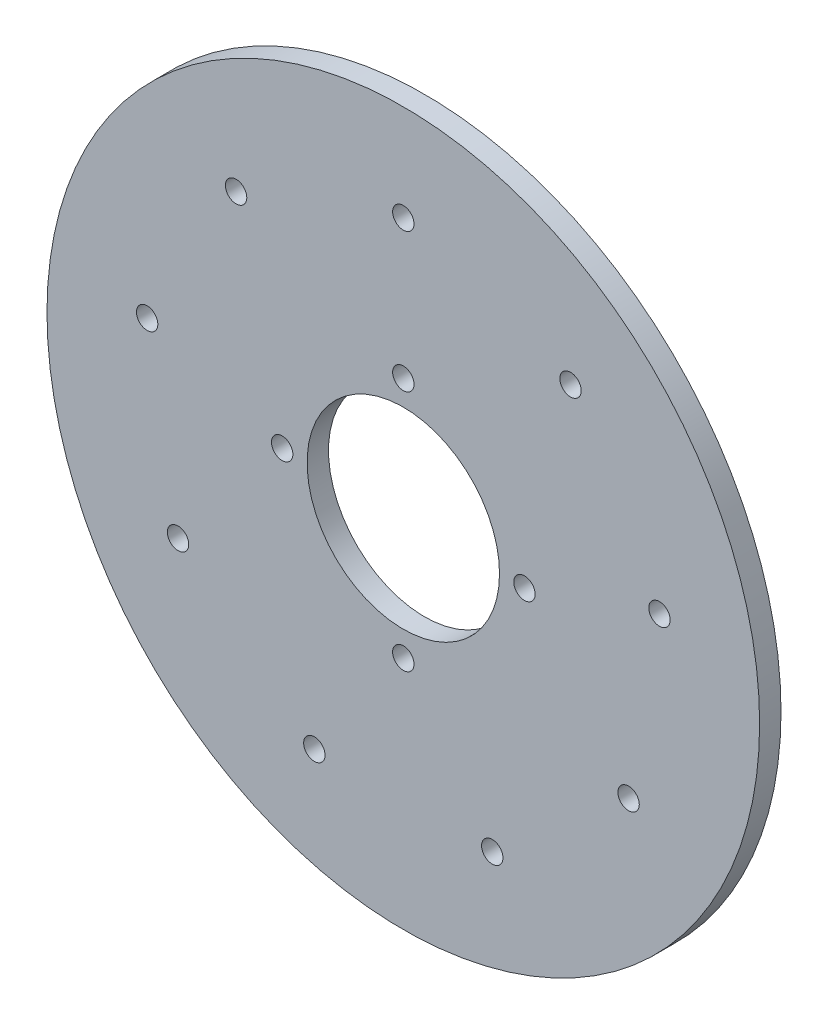
ISO-10303-21;
HEADER;
FILE_DESCRIPTION(('STEP AP214'),'2;1');
FILE_NAME('part.step','',(''),(''),'','','');
FILE_SCHEMA(('AUTOMOTIVE_DESIGN { 1 0 10303 214 1 1 1 1 }'));
ENDSEC;
DATA;
#1=APPLICATION_CONTEXT('core data for automotive mechanical design processes');
#2=APPLICATION_PROTOCOL_DEFINITION('international standard','automotive_design',2000,#1);
#3=PRODUCT_CONTEXT('',#1,'mechanical');
#4=PRODUCT('Part','Part','',(#3));
#5=PRODUCT_RELATED_PRODUCT_CATEGORY('part','',(#4));
#6=PRODUCT_DEFINITION_FORMATION('','',#4);
#7=PRODUCT_DEFINITION_CONTEXT('part definition',#1,'design');
#8=PRODUCT_DEFINITION('design','',#6,#7);
#9=PRODUCT_DEFINITION_SHAPE('','',#8);
#10=(LENGTH_UNIT() NAMED_UNIT(*) SI_UNIT(.MILLI.,.METRE.));
#11=(NAMED_UNIT(*) PLANE_ANGLE_UNIT() SI_UNIT($,.RADIAN.));
#12=(NAMED_UNIT(*) SI_UNIT($,.STERADIAN.) SOLID_ANGLE_UNIT());
#13=UNCERTAINTY_MEASURE_WITH_UNIT(LENGTH_MEASURE(1.E-05),#10,'distance_accuracy_value','');
#14=(GEOMETRIC_REPRESENTATION_CONTEXT(3) GLOBAL_UNCERTAINTY_ASSIGNED_CONTEXT((#13)) GLOBAL_UNIT_ASSIGNED_CONTEXT((#10,
#11,#12)) REPRESENTATION_CONTEXT('',''));
#15=CARTESIAN_POINT('',(0.,0.,0.));
#16=DIRECTION('',(0.,0.,1.));
#17=DIRECTION('',(1.,0.,0.));
#18=AXIS2_PLACEMENT_3D('',#15,#16,#17);
#19=CARTESIAN_POINT('',(0.,0.,3.));
#20=DIRECTION('',(0.,0.,1.));
#21=DIRECTION('',(1.,0.,0.));
#22=AXIS2_PLACEMENT_3D('',#19,#20,#21);
#23=PLANE('',#22);
#24=CARTESIAN_POINT('',(-31.609927238132,-18.25,3.));
#25=DIRECTION('',(0.,0.,1.));
#26=DIRECTION('',(1.,0.,0.));
#27=AXIS2_PLACEMENT_3D('',#24,#25,#26);
#28=CIRCLE('',#27,1.5);
#29=CARTESIAN_POINT('',(-30.109927238132,-18.25,3.));
#30=VERTEX_POINT('',#29);
#31=EDGE_CURVE('E148',#30,#30,#28,.T.);
#32=ORIENTED_EDGE('',*,*,#31,.F.);
#33=EDGE_LOOP('',(#32));
#34=FACE_BOUND('',#33,.T.);
#35=CARTESIAN_POINT('',(12.4837352313869,-34.2987806586857,3.));
#36=DIRECTION('',(0.,0.,1.));
#37=DIRECTION('',(1.,0.,0.));
#38=AXIS2_PLACEMENT_3D('',#35,#36,#37);
#39=CIRCLE('',#38,1.5);
#40=CARTESIAN_POINT('',(13.9837352313869,-34.2987806586857,3.));
#41=VERTEX_POINT('',#40);
#42=EDGE_CURVE('E132',#41,#41,#39,.T.);
#43=ORIENTED_EDGE('',*,*,#42,.F.);
#44=EDGE_LOOP('',(#43));
#45=FACE_BOUND('',#44,.T.);
#46=CARTESIAN_POINT('',(35.9454829849456,6.33815848484297,3.));
#47=DIRECTION('',(0.,0.,1.));
#48=DIRECTION('',(1.,0.,0.));
#49=AXIS2_PLACEMENT_3D('',#46,#47,#48);
#50=CIRCLE('',#49,1.5);
#51=CARTESIAN_POINT('',(37.4454829849456,6.33815848484297,3.));
#52=VERTEX_POINT('',#51);
#53=EDGE_CURVE('E116',#52,#52,#50,.T.);
#54=ORIENTED_EDGE('',*,*,#53,.F.);
#55=EDGE_LOOP('',(#54));
#56=FACE_BOUND('',#55,.T.);
#57=CARTESIAN_POINT('',(0.,36.5,3.));
#58=DIRECTION('',(0.,0.,1.));
#59=DIRECTION('',(1.,0.,0.));
#60=AXIS2_PLACEMENT_3D('',#57,#58,#59);
#61=CIRCLE('',#60,1.5);
#62=CARTESIAN_POINT('',(1.5,36.5,3.));
#63=VERTEX_POINT('',#62);
#64=EDGE_CURVE('E100',#63,#63,#61,.T.);
#65=ORIENTED_EDGE('',*,*,#64,.F.);
#66=EDGE_LOOP('',(#65));
#67=FACE_BOUND('',#66,.T.);
#68=CARTESIAN_POINT('',(0.,-17.,3.));
#69=DIRECTION('',(0.,0.,1.));
#70=DIRECTION('',(1.,0.,0.));
#71=AXIS2_PLACEMENT_3D('',#68,#69,#70);
#72=CIRCLE('',#71,1.5);
#73=CARTESIAN_POINT('',(1.5,-17.,3.));
#74=VERTEX_POINT('',#73);
#75=EDGE_CURVE('E84',#74,#74,#72,.T.);
#76=ORIENTED_EDGE('',*,*,#75,.F.);
#77=EDGE_LOOP('',(#76));
#78=FACE_BOUND('',#77,.T.);
#79=CARTESIAN_POINT('',(0.,0.,3.));
#80=DIRECTION('',(0.,0.,1.));
#81=DIRECTION('',(1.,0.,0.));
#82=AXIS2_PLACEMENT_3D('',#79,#80,#81);
#83=CIRCLE('',#82,13.5);
#84=CARTESIAN_POINT('',(13.5,0.,3.));
#85=VERTEX_POINT('',#84);
#86=EDGE_CURVE('E68',#85,#85,#83,.T.);
#87=ORIENTED_EDGE('',*,*,#86,.F.);
#88=EDGE_LOOP('',(#87));
#89=FACE_BOUND('',#88,.T.);
#90=CARTESIAN_POINT('',(0.,17.,3.));
#91=DIRECTION('',(0.,0.,1.));
#92=DIRECTION('',(1.,0.,0.));
#93=AXIS2_PLACEMENT_3D('',#90,#91,#92);
#94=CIRCLE('',#93,1.5);
#95=CARTESIAN_POINT('',(1.5,17.,3.));
#96=VERTEX_POINT('',#95);
#97=EDGE_CURVE('E54',#96,#96,#94,.T.);
#98=ORIENTED_EDGE('',*,*,#97,.F.);
#99=EDGE_LOOP('',(#98));
#100=FACE_BOUND('',#99,.T.);
#101=CARTESIAN_POINT('',(0.,0.,3.));
#102=DIRECTION('',(0.,0.,1.));
#103=DIRECTION('',(1.,0.,0.));
#104=AXIS2_PLACEMENT_3D('',#101,#102,#103);
#105=CIRCLE('',#104,50.);
#106=CARTESIAN_POINT('',(50.,0.,3.));
#107=VERTEX_POINT('',#106);
#108=EDGE_CURVE('E10',#107,#107,#105,.T.);
#109=ORIENTED_EDGE('',*,*,#108,.T.);
#110=EDGE_LOOP('',(#109));
#111=FACE_BOUND('',#110,.T.);
#112=CARTESIAN_POINT('',(-23.4617477535587,27.9606221738427,3.));
#113=DIRECTION('',(0.,0.,1.));
#114=DIRECTION('',(1.,0.,0.));
#115=AXIS2_PLACEMENT_3D('',#112,#113,#114);
#116=CIRCLE('',#115,1.5);
#117=CARTESIAN_POINT('',(-21.9617477535587,27.9606221738427,3.));
#118=VERTEX_POINT('',#117);
#119=EDGE_CURVE('E60',#118,#118,#116,.T.);
#120=ORIENTED_EDGE('',*,*,#119,.F.);
#121=EDGE_LOOP('',(#120));
#122=FACE_BOUND('',#121,.T.);
#123=CARTESIAN_POINT('',(17.,0.,3.));
#124=DIRECTION('',(0.,0.,1.));
#125=DIRECTION('',(1.,0.,0.));
#126=AXIS2_PLACEMENT_3D('',#123,#124,#125);
#127=CIRCLE('',#126,1.5);
#128=CARTESIAN_POINT('',(18.5,0.,3.));
#129=VERTEX_POINT('',#128);
#130=EDGE_CURVE('E76',#129,#129,#127,.T.);
#131=ORIENTED_EDGE('',*,*,#130,.F.);
#132=EDGE_LOOP('',(#131));
#133=FACE_BOUND('',#132,.T.);
#134=CARTESIAN_POINT('',(-17.,0.,3.));
#135=DIRECTION('',(0.,0.,1.));
#136=DIRECTION('',(1.,0.,0.));
#137=AXIS2_PLACEMENT_3D('',#134,#135,#136);
#138=CIRCLE('',#137,1.5);
#139=CARTESIAN_POINT('',(-15.5,0.,3.));
#140=VERTEX_POINT('',#139);
#141=EDGE_CURVE('E92',#140,#140,#138,.T.);
#142=ORIENTED_EDGE('',*,*,#141,.F.);
#143=EDGE_LOOP('',(#142));
#144=FACE_BOUND('',#143,.T.);
#145=CARTESIAN_POINT('',(23.4617477535587,27.9606221738427,3.));
#146=DIRECTION('',(0.,0.,1.));
#147=DIRECTION('',(1.,0.,0.));
#148=AXIS2_PLACEMENT_3D('',#145,#146,#147);
#149=CIRCLE('',#148,1.5);
#150=CARTESIAN_POINT('',(24.9617477535587,27.9606221738427,3.));
#151=VERTEX_POINT('',#150);
#152=EDGE_CURVE('E108',#151,#151,#149,.T.);
#153=ORIENTED_EDGE('',*,*,#152,.F.);
#154=EDGE_LOOP('',(#153));
#155=FACE_BOUND('',#154,.T.);
#156=CARTESIAN_POINT('',(31.609927238132,-18.25,3.));
#157=DIRECTION('',(0.,0.,1.));
#158=DIRECTION('',(1.,0.,0.));
#159=AXIS2_PLACEMENT_3D('',#156,#157,#158);
#160=CIRCLE('',#159,1.5);
#161=CARTESIAN_POINT('',(33.109927238132,-18.25,3.));
#162=VERTEX_POINT('',#161);
#163=EDGE_CURVE('E124',#162,#162,#160,.T.);
#164=ORIENTED_EDGE('',*,*,#163,.F.);
#165=EDGE_LOOP('',(#164));
#166=FACE_BOUND('',#165,.T.);
#167=CARTESIAN_POINT('',(-12.4837352313869,-34.2987806586857,3.));
#168=DIRECTION('',(0.,0.,1.));
#169=DIRECTION('',(1.,0.,0.));
#170=AXIS2_PLACEMENT_3D('',#167,#168,#169);
#171=CIRCLE('',#170,1.5);
#172=CARTESIAN_POINT('',(-10.9837352313869,-34.2987806586857,3.));
#173=VERTEX_POINT('',#172);
#174=EDGE_CURVE('E140',#173,#173,#171,.T.);
#175=ORIENTED_EDGE('',*,*,#174,.F.);
#176=EDGE_LOOP('',(#175));
#177=FACE_BOUND('',#176,.T.);
#178=CARTESIAN_POINT('',(-35.9454829849456,6.33815848484296,3.));
#179=DIRECTION('',(0.,0.,1.));
#180=DIRECTION('',(1.,0.,0.));
#181=AXIS2_PLACEMENT_3D('',#178,#179,#180);
#182=CIRCLE('',#181,1.5);
#183=CARTESIAN_POINT('',(-34.4454829849456,6.33815848484296,3.));
#184=VERTEX_POINT('',#183);
#185=EDGE_CURVE('E156',#184,#184,#182,.T.);
#186=ORIENTED_EDGE('',*,*,#185,.F.);
#187=EDGE_LOOP('',(#186));
#188=FACE_BOUND('',#187,.T.);
#189=ADVANCED_FACE('F41',(#34,#45,#56,#67,#78,#89,#100,#111,#122,#133,#144,#155,#166,#177,#188),
#23,.T.);
#190=CARTESIAN_POINT('',(0.,0.,0.));
#191=DIRECTION('',(0.,0.,1.));
#192=DIRECTION('',(1.,0.,0.));
#193=AXIS2_PLACEMENT_3D('',#190,#191,#192);
#194=PLANE('',#193);
#195=CARTESIAN_POINT('',(0.,0.,0.));
#196=DIRECTION('',(0.,0.,1.));
#197=DIRECTION('',(1.,0.,0.));
#198=AXIS2_PLACEMENT_3D('',#195,#196,#197);
#199=CIRCLE('',#198,50.);
#200=CARTESIAN_POINT('',(50.,0.,0.));
#201=VERTEX_POINT('',#200);
#202=EDGE_CURVE('E45',#201,#201,#199,.T.);
#203=ORIENTED_EDGE('',*,*,#202,.F.);
#204=EDGE_LOOP('',(#203));
#205=FACE_BOUND('',#204,.T.);
#206=CARTESIAN_POINT('',(0.,17.,0.));
#207=DIRECTION('',(0.,0.,1.));
#208=DIRECTION('',(1.,0.,0.));
#209=AXIS2_PLACEMENT_3D('',#206,#207,#208);
#210=CIRCLE('',#209,1.5);
#211=CARTESIAN_POINT('',(1.5,17.,0.));
#212=VERTEX_POINT('',#211);
#213=EDGE_CURVE('E56',#212,#212,#210,.T.);
#214=ORIENTED_EDGE('',*,*,#213,.T.);
#215=EDGE_LOOP('',(#214));
#216=FACE_BOUND('',#215,.T.);
#217=CARTESIAN_POINT('',(-23.4617477535587,27.9606221738427,0.));
#218=DIRECTION('',(0.,0.,1.));
#219=DIRECTION('',(1.,0.,0.));
#220=AXIS2_PLACEMENT_3D('',#217,#218,#219);
#221=CIRCLE('',#220,1.5);
#222=CARTESIAN_POINT('',(-21.9617477535587,27.9606221738427,0.));
#223=VERTEX_POINT('',#222);
#224=EDGE_CURVE('E64',#223,#223,#221,.T.);
#225=ORIENTED_EDGE('',*,*,#224,.T.);
#226=EDGE_LOOP('',(#225));
#227=FACE_BOUND('',#226,.T.);
#228=CARTESIAN_POINT('',(0.,0.,0.));
#229=DIRECTION('',(0.,0.,1.));
#230=DIRECTION('',(1.,0.,0.));
#231=AXIS2_PLACEMENT_3D('',#228,#229,#230);
#232=CIRCLE('',#231,13.5);
#233=CARTESIAN_POINT('',(13.5,0.,0.));
#234=VERTEX_POINT('',#233);
#235=EDGE_CURVE('E72',#234,#234,#232,.T.);
#236=ORIENTED_EDGE('',*,*,#235,.T.);
#237=EDGE_LOOP('',(#236));
#238=FACE_BOUND('',#237,.T.);
#239=CARTESIAN_POINT('',(17.,0.,0.));
#240=DIRECTION('',(0.,0.,1.));
#241=DIRECTION('',(1.,0.,0.));
#242=AXIS2_PLACEMENT_3D('',#239,#240,#241);
#243=CIRCLE('',#242,1.5);
#244=CARTESIAN_POINT('',(18.5,0.,0.));
#245=VERTEX_POINT('',#244);
#246=EDGE_CURVE('E80',#245,#245,#243,.T.);
#247=ORIENTED_EDGE('',*,*,#246,.T.);
#248=EDGE_LOOP('',(#247));
#249=FACE_BOUND('',#248,.T.);
#250=CARTESIAN_POINT('',(0.,-17.,0.));
#251=DIRECTION('',(0.,0.,1.));
#252=DIRECTION('',(1.,0.,0.));
#253=AXIS2_PLACEMENT_3D('',#250,#251,#252);
#254=CIRCLE('',#253,1.5);
#255=CARTESIAN_POINT('',(1.5,-17.,0.));
#256=VERTEX_POINT('',#255);
#257=EDGE_CURVE('E88',#256,#256,#254,.T.);
#258=ORIENTED_EDGE('',*,*,#257,.T.);
#259=EDGE_LOOP('',(#258));
#260=FACE_BOUND('',#259,.T.);
#261=CARTESIAN_POINT('',(-17.,0.,0.));
#262=DIRECTION('',(0.,0.,1.));
#263=DIRECTION('',(1.,0.,0.));
#264=AXIS2_PLACEMENT_3D('',#261,#262,#263);
#265=CIRCLE('',#264,1.5);
#266=CARTESIAN_POINT('',(-15.5,0.,0.));
#267=VERTEX_POINT('',#266);
#268=EDGE_CURVE('E96',#267,#267,#265,.T.);
#269=ORIENTED_EDGE('',*,*,#268,.T.);
#270=EDGE_LOOP('',(#269));
#271=FACE_BOUND('',#270,.T.);
#272=CARTESIAN_POINT('',(0.,36.5,0.));
#273=DIRECTION('',(0.,0.,1.));
#274=DIRECTION('',(1.,0.,0.));
#275=AXIS2_PLACEMENT_3D('',#272,#273,#274);
#276=CIRCLE('',#275,1.5);
#277=CARTESIAN_POINT('',(1.5,36.5,0.));
#278=VERTEX_POINT('',#277);
#279=EDGE_CURVE('E104',#278,#278,#276,.T.);
#280=ORIENTED_EDGE('',*,*,#279,.T.);
#281=EDGE_LOOP('',(#280));
#282=FACE_BOUND('',#281,.T.);
#283=CARTESIAN_POINT('',(23.4617477535587,27.9606221738427,0.));
#284=DIRECTION('',(0.,0.,1.));
#285=DIRECTION('',(1.,0.,0.));
#286=AXIS2_PLACEMENT_3D('',#283,#284,#285);
#287=CIRCLE('',#286,1.5);
#288=CARTESIAN_POINT('',(24.9617477535587,27.9606221738427,0.));
#289=VERTEX_POINT('',#288);
#290=EDGE_CURVE('E112',#289,#289,#287,.T.);
#291=ORIENTED_EDGE('',*,*,#290,.T.);
#292=EDGE_LOOP('',(#291));
#293=FACE_BOUND('',#292,.T.);
#294=CARTESIAN_POINT('',(35.9454829849456,6.33815848484297,0.));
#295=DIRECTION('',(0.,0.,1.));
#296=DIRECTION('',(1.,0.,0.));
#297=AXIS2_PLACEMENT_3D('',#294,#295,#296);
#298=CIRCLE('',#297,1.5);
#299=CARTESIAN_POINT('',(37.4454829849456,6.33815848484297,0.));
#300=VERTEX_POINT('',#299);
#301=EDGE_CURVE('E120',#300,#300,#298,.T.);
#302=ORIENTED_EDGE('',*,*,#301,.T.);
#303=EDGE_LOOP('',(#302));
#304=FACE_BOUND('',#303,.T.);
#305=CARTESIAN_POINT('',(31.609927238132,-18.25,0.));
#306=DIRECTION('',(0.,0.,1.));
#307=DIRECTION('',(1.,0.,0.));
#308=AXIS2_PLACEMENT_3D('',#305,#306,#307);
#309=CIRCLE('',#308,1.5);
#310=CARTESIAN_POINT('',(33.109927238132,-18.25,0.));
#311=VERTEX_POINT('',#310);
#312=EDGE_CURVE('E128',#311,#311,#309,.T.);
#313=ORIENTED_EDGE('',*,*,#312,.T.);
#314=EDGE_LOOP('',(#313));
#315=FACE_BOUND('',#314,.T.);
#316=CARTESIAN_POINT('',(12.4837352313869,-34.2987806586857,0.));
#317=DIRECTION('',(0.,0.,1.));
#318=DIRECTION('',(1.,0.,0.));
#319=AXIS2_PLACEMENT_3D('',#316,#317,#318);
#320=CIRCLE('',#319,1.5);
#321=CARTESIAN_POINT('',(13.9837352313869,-34.2987806586857,0.));
#322=VERTEX_POINT('',#321);
#323=EDGE_CURVE('E136',#322,#322,#320,.T.);
#324=ORIENTED_EDGE('',*,*,#323,.T.);
#325=EDGE_LOOP('',(#324));
#326=FACE_BOUND('',#325,.T.);
#327=CARTESIAN_POINT('',(-12.4837352313869,-34.2987806586857,0.));
#328=DIRECTION('',(0.,0.,1.));
#329=DIRECTION('',(1.,0.,0.));
#330=AXIS2_PLACEMENT_3D('',#327,#328,#329);
#331=CIRCLE('',#330,1.5);
#332=CARTESIAN_POINT('',(-10.9837352313869,-34.2987806586857,0.));
#333=VERTEX_POINT('',#332);
#334=EDGE_CURVE('E144',#333,#333,#331,.T.);
#335=ORIENTED_EDGE('',*,*,#334,.T.);
#336=EDGE_LOOP('',(#335));
#337=FACE_BOUND('',#336,.T.);
#338=CARTESIAN_POINT('',(-31.609927238132,-18.25,0.));
#339=DIRECTION('',(0.,0.,1.));
#340=DIRECTION('',(1.,0.,0.));
#341=AXIS2_PLACEMENT_3D('',#338,#339,#340);
#342=CIRCLE('',#341,1.5);
#343=CARTESIAN_POINT('',(-30.109927238132,-18.25,0.));
#344=VERTEX_POINT('',#343);
#345=EDGE_CURVE('E152',#344,#344,#342,.T.);
#346=ORIENTED_EDGE('',*,*,#345,.T.);
#347=EDGE_LOOP('',(#346));
#348=FACE_BOUND('',#347,.T.);
#349=CARTESIAN_POINT('',(-35.9454829849456,6.33815848484296,0.));
#350=DIRECTION('',(0.,0.,1.));
#351=DIRECTION('',(1.,0.,0.));
#352=AXIS2_PLACEMENT_3D('',#349,#350,#351);
#353=CIRCLE('',#352,1.5);
#354=CARTESIAN_POINT('',(-34.4454829849456,6.33815848484296,0.));
#355=VERTEX_POINT('',#354);
#356=EDGE_CURVE('E160',#355,#355,#353,.T.);
#357=ORIENTED_EDGE('',*,*,#356,.T.);
#358=EDGE_LOOP('',(#357));
#359=FACE_BOUND('',#358,.T.);
#360=ADVANCED_FACE('F172',(#205,#216,#227,#238,#249,#260,#271,#282,#293,#304,#315,#326,#337,
#348,#359),#194,.F.);
#361=CARTESIAN_POINT('',(0.,0.,3.));
#362=DIRECTION('',(0.,0.,-1.));
#363=DIRECTION('',(-1.,0.,0.));
#364=AXIS2_PLACEMENT_3D('',#361,#362,#363);
#365=CYLINDRICAL_SURFACE('',#364,50.);
#366=ORIENTED_EDGE('',*,*,#108,.F.);
#367=EDGE_LOOP('',(#366));
#368=FACE_BOUND('',#367,.T.);
#369=ORIENTED_EDGE('',*,*,#202,.T.);
#370=EDGE_LOOP('',(#369));
#371=FACE_BOUND('',#370,.T.);
#372=ADVANCED_FACE('F43',(#368,#371),#365,.T.);
#373=CARTESIAN_POINT('',(0.,17.,3.));
#374=DIRECTION('',(0.,0.,-1.));
#375=DIRECTION('',(-1.,0.,0.));
#376=AXIS2_PLACEMENT_3D('',#373,#374,#375);
#377=CYLINDRICAL_SURFACE('',#376,1.5);
#378=ORIENTED_EDGE('',*,*,#97,.T.);
#379=EDGE_LOOP('',(#378));
#380=FACE_BOUND('',#379,.T.);
#381=ORIENTED_EDGE('',*,*,#213,.F.);
#382=EDGE_LOOP('',(#381));
#383=FACE_BOUND('',#382,.T.);
#384=ADVANCED_FACE('F182',(#380,#383),#377,.F.);
#385=CARTESIAN_POINT('',(-23.4617477535587,27.9606221738427,3.));
#386=DIRECTION('',(0.,0.,-1.));
#387=DIRECTION('',(-1.,0.,0.));
#388=AXIS2_PLACEMENT_3D('',#385,#386,#387);
#389=CYLINDRICAL_SURFACE('',#388,1.5);
#390=ORIENTED_EDGE('',*,*,#119,.T.);
#391=EDGE_LOOP('',(#390));
#392=FACE_BOUND('',#391,.T.);
#393=ORIENTED_EDGE('',*,*,#224,.F.);
#394=EDGE_LOOP('',(#393));
#395=FACE_BOUND('',#394,.T.);
#396=ADVANCED_FACE('F185',(#392,#395),#389,.F.);
#397=CARTESIAN_POINT('',(0.,0.,3.));
#398=DIRECTION('',(0.,0.,-1.));
#399=DIRECTION('',(-1.,0.,0.));
#400=AXIS2_PLACEMENT_3D('',#397,#398,#399);
#401=CYLINDRICAL_SURFACE('',#400,13.5);
#402=ORIENTED_EDGE('',*,*,#86,.T.);
#403=EDGE_LOOP('',(#402));
#404=FACE_BOUND('',#403,.T.);
#405=ORIENTED_EDGE('',*,*,#235,.F.);
#406=EDGE_LOOP('',(#405));
#407=FACE_BOUND('',#406,.T.);
#408=ADVANCED_FACE('F189',(#404,#407),#401,.F.);
#409=CARTESIAN_POINT('',(17.,0.,3.));
#410=DIRECTION('',(0.,0.,-1.));
#411=DIRECTION('',(-1.,0.,0.));
#412=AXIS2_PLACEMENT_3D('',#409,#410,#411);
#413=CYLINDRICAL_SURFACE('',#412,1.5);
#414=ORIENTED_EDGE('',*,*,#130,.T.);
#415=EDGE_LOOP('',(#414));
#416=FACE_BOUND('',#415,.T.);
#417=ORIENTED_EDGE('',*,*,#246,.F.);
#418=EDGE_LOOP('',(#417));
#419=FACE_BOUND('',#418,.T.);
#420=ADVANCED_FACE('F193',(#416,#419),#413,.F.);
#421=CARTESIAN_POINT('',(0.,-17.,3.));
#422=DIRECTION('',(0.,0.,-1.));
#423=DIRECTION('',(-1.,0.,0.));
#424=AXIS2_PLACEMENT_3D('',#421,#422,#423);
#425=CYLINDRICAL_SURFACE('',#424,1.5);
#426=ORIENTED_EDGE('',*,*,#75,.T.);
#427=EDGE_LOOP('',(#426));
#428=FACE_BOUND('',#427,.T.);
#429=ORIENTED_EDGE('',*,*,#257,.F.);
#430=EDGE_LOOP('',(#429));
#431=FACE_BOUND('',#430,.T.);
#432=ADVANCED_FACE('F197',(#428,#431),#425,.F.);
#433=CARTESIAN_POINT('',(-17.,0.,3.));
#434=DIRECTION('',(0.,0.,-1.));
#435=DIRECTION('',(-1.,0.,0.));
#436=AXIS2_PLACEMENT_3D('',#433,#434,#435);
#437=CYLINDRICAL_SURFACE('',#436,1.5);
#438=ORIENTED_EDGE('',*,*,#141,.T.);
#439=EDGE_LOOP('',(#438));
#440=FACE_BOUND('',#439,.T.);
#441=ORIENTED_EDGE('',*,*,#268,.F.);
#442=EDGE_LOOP('',(#441));
#443=FACE_BOUND('',#442,.T.);
#444=ADVANCED_FACE('F201',(#440,#443),#437,.F.);
#445=CARTESIAN_POINT('',(0.,36.5,3.));
#446=DIRECTION('',(0.,0.,-1.));
#447=DIRECTION('',(-1.,0.,0.));
#448=AXIS2_PLACEMENT_3D('',#445,#446,#447);
#449=CYLINDRICAL_SURFACE('',#448,1.5);
#450=ORIENTED_EDGE('',*,*,#64,.T.);
#451=EDGE_LOOP('',(#450));
#452=FACE_BOUND('',#451,.T.);
#453=ORIENTED_EDGE('',*,*,#279,.F.);
#454=EDGE_LOOP('',(#453));
#455=FACE_BOUND('',#454,.T.);
#456=ADVANCED_FACE('F205',(#452,#455),#449,.F.);
#457=CARTESIAN_POINT('',(23.4617477535587,27.9606221738427,3.));
#458=DIRECTION('',(0.,0.,-1.));
#459=DIRECTION('',(-1.,0.,0.));
#460=AXIS2_PLACEMENT_3D('',#457,#458,#459);
#461=CYLINDRICAL_SURFACE('',#460,1.5);
#462=ORIENTED_EDGE('',*,*,#152,.T.);
#463=EDGE_LOOP('',(#462));
#464=FACE_BOUND('',#463,.T.);
#465=ORIENTED_EDGE('',*,*,#290,.F.);
#466=EDGE_LOOP('',(#465));
#467=FACE_BOUND('',#466,.T.);
#468=ADVANCED_FACE('F209',(#464,#467),#461,.F.);
#469=CARTESIAN_POINT('',(35.9454829849456,6.33815848484297,3.));
#470=DIRECTION('',(0.,0.,-1.));
#471=DIRECTION('',(-1.,0.,0.));
#472=AXIS2_PLACEMENT_3D('',#469,#470,#471);
#473=CYLINDRICAL_SURFACE('',#472,1.5);
#474=ORIENTED_EDGE('',*,*,#53,.T.);
#475=EDGE_LOOP('',(#474));
#476=FACE_BOUND('',#475,.T.);
#477=ORIENTED_EDGE('',*,*,#301,.F.);
#478=EDGE_LOOP('',(#477));
#479=FACE_BOUND('',#478,.T.);
#480=ADVANCED_FACE('F213',(#476,#479),#473,.F.);
#481=CARTESIAN_POINT('',(31.609927238132,-18.25,3.));
#482=DIRECTION('',(0.,0.,-1.));
#483=DIRECTION('',(-1.,0.,0.));
#484=AXIS2_PLACEMENT_3D('',#481,#482,#483);
#485=CYLINDRICAL_SURFACE('',#484,1.5);
#486=ORIENTED_EDGE('',*,*,#163,.T.);
#487=EDGE_LOOP('',(#486));
#488=FACE_BOUND('',#487,.T.);
#489=ORIENTED_EDGE('',*,*,#312,.F.);
#490=EDGE_LOOP('',(#489));
#491=FACE_BOUND('',#490,.T.);
#492=ADVANCED_FACE('F217',(#488,#491),#485,.F.);
#493=CARTESIAN_POINT('',(12.4837352313869,-34.2987806586857,3.));
#494=DIRECTION('',(0.,0.,-1.));
#495=DIRECTION('',(-1.,0.,0.));
#496=AXIS2_PLACEMENT_3D('',#493,#494,#495);
#497=CYLINDRICAL_SURFACE('',#496,1.5);
#498=ORIENTED_EDGE('',*,*,#42,.T.);
#499=EDGE_LOOP('',(#498));
#500=FACE_BOUND('',#499,.T.);
#501=ORIENTED_EDGE('',*,*,#323,.F.);
#502=EDGE_LOOP('',(#501));
#503=FACE_BOUND('',#502,.T.);
#504=ADVANCED_FACE('F221',(#500,#503),#497,.F.);
#505=CARTESIAN_POINT('',(-12.4837352313869,-34.2987806586857,3.));
#506=DIRECTION('',(0.,0.,-1.));
#507=DIRECTION('',(-1.,0.,0.));
#508=AXIS2_PLACEMENT_3D('',#505,#506,#507);
#509=CYLINDRICAL_SURFACE('',#508,1.5);
#510=ORIENTED_EDGE('',*,*,#174,.T.);
#511=EDGE_LOOP('',(#510));
#512=FACE_BOUND('',#511,.T.);
#513=ORIENTED_EDGE('',*,*,#334,.F.);
#514=EDGE_LOOP('',(#513));
#515=FACE_BOUND('',#514,.T.);
#516=ADVANCED_FACE('F225',(#512,#515),#509,.F.);
#517=CARTESIAN_POINT('',(-31.609927238132,-18.25,3.));
#518=DIRECTION('',(0.,0.,-1.));
#519=DIRECTION('',(-1.,0.,0.));
#520=AXIS2_PLACEMENT_3D('',#517,#518,#519);
#521=CYLINDRICAL_SURFACE('',#520,1.5);
#522=ORIENTED_EDGE('',*,*,#31,.T.);
#523=EDGE_LOOP('',(#522));
#524=FACE_BOUND('',#523,.T.);
#525=ORIENTED_EDGE('',*,*,#345,.F.);
#526=EDGE_LOOP('',(#525));
#527=FACE_BOUND('',#526,.T.);
#528=ADVANCED_FACE('F229',(#524,#527),#521,.F.);
#529=CARTESIAN_POINT('',(-35.9454829849456,6.33815848484296,3.));
#530=DIRECTION('',(0.,0.,-1.));
#531=DIRECTION('',(-1.,0.,0.));
#532=AXIS2_PLACEMENT_3D('',#529,#530,#531);
#533=CYLINDRICAL_SURFACE('',#532,1.5);
#534=ORIENTED_EDGE('',*,*,#185,.T.);
#535=EDGE_LOOP('',(#534));
#536=FACE_BOUND('',#535,.T.);
#537=ORIENTED_EDGE('',*,*,#356,.F.);
#538=EDGE_LOOP('',(#537));
#539=FACE_BOUND('',#538,.T.);
#540=ADVANCED_FACE('F168',(#536,#539),#533,.F.);
#541=CLOSED_SHELL('',(#189,#360,#372,#384,#396,#408,#420,#432,#444,#456,#468,#480,#492,#504,
#516,#528,#540));
#542=MANIFOLD_SOLID_BREP('B2',#541);
#543=ADVANCED_BREP_SHAPE_REPRESENTATION('',(#18,#542),#14);
#544=SHAPE_DEFINITION_REPRESENTATION(#9,#543);
ENDSEC;
END-ISO-10303-21;
